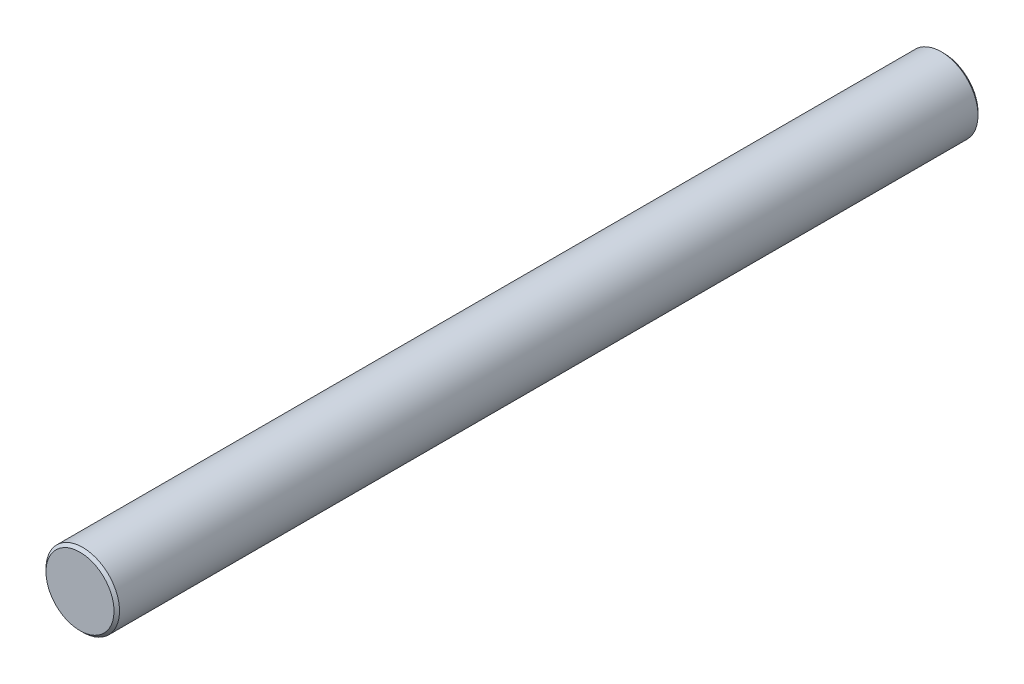
ISO-10303-21;
HEADER;
FILE_DESCRIPTION(('STEP AP214'),'2;1');
FILE_NAME('part.step','',(''),(''),'','','');
FILE_SCHEMA(('AUTOMOTIVE_DESIGN { 1 0 10303 214 1 1 1 1 }'));
ENDSEC;
DATA;
#1=APPLICATION_CONTEXT('core data for automotive mechanical design processes');
#2=APPLICATION_PROTOCOL_DEFINITION('international standard','automotive_design',2000,#1);
#3=PRODUCT_CONTEXT('',#1,'mechanical');
#4=PRODUCT('Part','Part','',(#3));
#5=PRODUCT_RELATED_PRODUCT_CATEGORY('part','',(#4));
#6=PRODUCT_DEFINITION_FORMATION('','',#4);
#7=PRODUCT_DEFINITION_CONTEXT('part definition',#1,'design');
#8=PRODUCT_DEFINITION('design','',#6,#7);
#9=PRODUCT_DEFINITION_SHAPE('','',#8);
#10=(LENGTH_UNIT() NAMED_UNIT(*) SI_UNIT(.MILLI.,.METRE.));
#11=(NAMED_UNIT(*) PLANE_ANGLE_UNIT() SI_UNIT($,.RADIAN.));
#12=(NAMED_UNIT(*) SI_UNIT($,.STERADIAN.) SOLID_ANGLE_UNIT());
#13=UNCERTAINTY_MEASURE_WITH_UNIT(LENGTH_MEASURE(1.E-05),#10,'distance_accuracy_value','');
#14=(GEOMETRIC_REPRESENTATION_CONTEXT(3) GLOBAL_UNCERTAINTY_ASSIGNED_CONTEXT((#13)) GLOBAL_UNIT_ASSIGNED_CONTEXT((#10,
#11,#12)) REPRESENTATION_CONTEXT('',''));
#15=CARTESIAN_POINT('',(0.,0.,0.));
#16=DIRECTION('',(0.,0.,1.));
#17=DIRECTION('',(1.,0.,0.));
#18=AXIS2_PLACEMENT_3D('',#15,#16,#17);
#19=CARTESIAN_POINT('',(0.,9.25,0.));
#20=DIRECTION('',(0.,0.,-1.));
#21=DIRECTION('',(0.,1.,0.));
#22=AXIS2_PLACEMENT_3D('',#19,#20,#21);
#23=PLANE('',#22);
#24=CARTESIAN_POINT('',(0.,0.,0.));
#25=DIRECTION('',(0.,0.,-1.));
#26=DIRECTION('',(0.,1.,0.));
#27=AXIS2_PLACEMENT_3D('',#24,#25,#26);
#28=CIRCLE('',#27,18.5);
#29=CARTESIAN_POINT('',(0.,18.5,0.));
#30=VERTEX_POINT('',#29);
#31=EDGE_CURVE('E9',#30,#30,#28,.T.);
#32=ORIENTED_EDGE('',*,*,#31,.T.);
#33=EDGE_LOOP('',(#32));
#34=FACE_BOUND('',#33,.T.);
#35=CARTESIAN_POINT('',(0.,0.,0.));
#36=DIRECTION('',(0.,0.,1.));
#37=DIRECTION('',(-1.,0.,0.));
#38=AXIS2_PLACEMENT_3D('',#35,#36,#37);
#39=CIRCLE('',#38,6.);
#40=CARTESIAN_POINT('',(-6.,0.,0.));
#41=VERTEX_POINT('',#40);
#42=EDGE_CURVE('E52',#41,#41,#39,.T.);
#43=ORIENTED_EDGE('',*,*,#42,.T.);
#44=EDGE_LOOP('',(#43));
#45=FACE_BOUND('',#44,.T.);
#46=ADVANCED_FACE('F15',(#34,#45),#23,.T.);
#47=CARTESIAN_POINT('',(0.,0.,0.75));
#48=DIRECTION('',(0.,0.,1.));
#49=DIRECTION('',(0.,1.,0.));
#50=AXIS2_PLACEMENT_3D('',#47,#48,#49);
#51=CONICAL_SURFACE('',#50,19.25,0.785398163397448);
#52=CARTESIAN_POINT('',(0.,0.,1.5));
#53=DIRECTION('',(0.,0.,-1.));
#54=DIRECTION('',(0.,1.,0.));
#55=AXIS2_PLACEMENT_3D('',#52,#53,#54);
#56=CIRCLE('',#55,20.);
#57=CARTESIAN_POINT('',(0.,20.,1.5));
#58=VERTEX_POINT('',#57);
#59=EDGE_CURVE('E25',#58,#58,#56,.T.);
#60=ORIENTED_EDGE('',*,*,#59,.T.);
#61=EDGE_LOOP('',(#60));
#62=FACE_BOUND('',#61,.T.);
#63=ORIENTED_EDGE('',*,*,#31,.F.);
#64=EDGE_LOOP('',(#63));
#65=FACE_BOUND('',#64,.T.);
#66=ADVANCED_FACE('F121',(#62,#65),#51,.T.);
#67=CARTESIAN_POINT('',(0.,0.,235.));
#68=DIRECTION('',(0.,0.,1.));
#69=DIRECTION('',(0.,1.,0.));
#70=AXIS2_PLACEMENT_3D('',#67,#68,#69);
#71=CYLINDRICAL_SURFACE('',#70,20.);
#72=CARTESIAN_POINT('',(0.,0.,468.5));
#73=DIRECTION('',(0.,0.,-1.));
#74=DIRECTION('',(0.,1.,0.));
#75=AXIS2_PLACEMENT_3D('',#72,#73,#74);
#76=CIRCLE('',#75,20.);
#77=CARTESIAN_POINT('',(0.,20.,468.5));
#78=VERTEX_POINT('',#77);
#79=EDGE_CURVE('E19',#78,#78,#76,.T.);
#80=ORIENTED_EDGE('',*,*,#79,.T.);
#81=EDGE_LOOP('',(#80));
#82=FACE_BOUND('',#81,.T.);
#83=ORIENTED_EDGE('',*,*,#59,.F.);
#84=EDGE_LOOP('',(#83));
#85=FACE_BOUND('',#84,.T.);
#86=CARTESIAN_POINT('',(0.,0.,6.5));
#87=DIRECTION('',(0.,0.,-1.));
#88=DIRECTION('',(0.,1.,0.));
#89=AXIS2_PLACEMENT_3D('',#86,#87,#88);
#90=CIRCLE('',#89,20.);
#91=CARTESIAN_POINT('',(10.5356537528527,-17.,6.5));
#92=VERTEX_POINT('',#91);
#93=CARTESIAN_POINT('',(-10.5356537528527,-17.,6.5));
#94=VERTEX_POINT('',#93);
#95=EDGE_CURVE('E69',#92,#94,#90,.T.);
#96=ORIENTED_EDGE('',*,*,#95,.T.);
#97=DIRECTION('',(0.,0.,1.));
#98=VECTOR('',#97,1.);
#99=CARTESIAN_POINT('',(-10.5356537528527,-17.,8.25));
#100=LINE('',#99,#98);
#101=CARTESIAN_POINT('',(-10.5356537528527,-17.,10.));
#102=VERTEX_POINT('',#101);
#103=EDGE_CURVE('E62',#94,#102,#100,.T.);
#104=ORIENTED_EDGE('',*,*,#103,.T.);
#105=CARTESIAN_POINT('',(0.,0.,10.));
#106=DIRECTION('',(0.,0.,1.));
#107=DIRECTION('',(0.,1.,0.));
#108=AXIS2_PLACEMENT_3D('',#105,#106,#107);
#109=CIRCLE('',#108,20.);
#110=CARTESIAN_POINT('',(10.5356537528527,-17.,10.));
#111=VERTEX_POINT('',#110);
#112=EDGE_CURVE('E75',#102,#111,#109,.T.);
#113=ORIENTED_EDGE('',*,*,#112,.T.);
#114=DIRECTION('',(0.,0.,-1.));
#115=VECTOR('',#114,1.);
#116=CARTESIAN_POINT('',(10.5356537528527,-17.,8.25));
#117=LINE('',#116,#115);
#118=EDGE_CURVE('E60',#111,#92,#117,.T.);
#119=ORIENTED_EDGE('',*,*,#118,.T.);
#120=EDGE_LOOP('',(#96,#104,#113,#119));
#121=FACE_BOUND('',#120,.T.);
#122=ADVANCED_FACE('F17',(#82,#85,#121),#71,.T.);
#123=CARTESIAN_POINT('',(0.,0.,469.25));
#124=DIRECTION('',(0.,0.,-1.));
#125=DIRECTION('',(0.,1.,0.));
#126=AXIS2_PLACEMENT_3D('',#123,#124,#125);
#127=CONICAL_SURFACE('',#126,19.25,0.785398163397448);
#128=CARTESIAN_POINT('',(0.,0.,470.));
#129=DIRECTION('',(0.,0.,-1.));
#130=DIRECTION('',(0.,1.,0.));
#131=AXIS2_PLACEMENT_3D('',#128,#129,#130);
#132=CIRCLE('',#131,18.5);
#133=CARTESIAN_POINT('',(0.,18.5,470.));
#134=VERTEX_POINT('',#133);
#135=EDGE_CURVE('E44',#134,#134,#132,.T.);
#136=ORIENTED_EDGE('',*,*,#135,.T.);
#137=EDGE_LOOP('',(#136));
#138=FACE_BOUND('',#137,.T.);
#139=ORIENTED_EDGE('',*,*,#79,.F.);
#140=EDGE_LOOP('',(#139));
#141=FACE_BOUND('',#140,.T.);
#142=ADVANCED_FACE('F116',(#138,#141),#127,.T.);
#143=CARTESIAN_POINT('',(0.,9.25,470.));
#144=DIRECTION('',(0.,0.,1.));
#145=DIRECTION('',(0.,-1.,0.));
#146=AXIS2_PLACEMENT_3D('',#143,#144,#145);
#147=PLANE('',#146);
#148=ORIENTED_EDGE('',*,*,#135,.F.);
#149=EDGE_LOOP('',(#148));
#150=FACE_BOUND('',#149,.T.);
#151=ADVANCED_FACE('F110',(#150),#147,.T.);
#152=CARTESIAN_POINT('',(0.,0.,26.4586213285198));
#153=DIRECTION('',(0.,0.,-1.));
#154=DIRECTION('',(-1.,0.,0.));
#155=AXIS2_PLACEMENT_3D('',#152,#153,#154);
#156=CONICAL_SURFACE('',#155,2.52640625,1.0471975511966);
#157=CARTESIAN_POINT('',(0.,0.,25.));
#158=DIRECTION('',(0.,0.,1.));
#159=DIRECTION('',(-1.,0.,0.));
#160=AXIS2_PLACEMENT_3D('',#157,#158,#159);
#161=CIRCLE('',#160,5.0528125);
#162=CARTESIAN_POINT('',(-5.0528125,0.,25.));
#163=VERTEX_POINT('',#162);
#164=EDGE_CURVE('E51',#163,#163,#161,.T.);
#165=ORIENTED_EDGE('',*,*,#164,.F.);
#166=EDGE_LOOP('',(#165));
#167=FACE_BOUND('',#166,.T.);
#168=CARTESIAN_POINT('',(0.,0.,27.9172426570397));
#169=VERTEX_POINT('',#168);
#170=VERTEX_LOOP('',#169);
#171=FACE_BOUND('',#170,.T.);
#172=ADVANCED_FACE('F104',(#167,#171),#156,.F.);
#173=CARTESIAN_POINT('',(0.,0.,12.97359375));
#174=DIRECTION('',(0.,0.,-1.));
#175=DIRECTION('',(-1.,0.,0.));
#176=AXIS2_PLACEMENT_3D('',#173,#174,#175);
#177=CYLINDRICAL_SURFACE('',#176,5.0528125);
#178=CARTESIAN_POINT('',(0.,0.,0.9471875));
#179=DIRECTION('',(0.,0.,1.));
#180=DIRECTION('',(-1.,0.,0.));
#181=AXIS2_PLACEMENT_3D('',#178,#179,#180);
#182=CIRCLE('',#181,5.0528125);
#183=CARTESIAN_POINT('',(-5.0528125,0.,0.9471875));
#184=VERTEX_POINT('',#183);
#185=EDGE_CURVE('E57',#184,#184,#182,.T.);
#186=ORIENTED_EDGE('',*,*,#185,.F.);
#187=EDGE_LOOP('',(#186));
#188=FACE_BOUND('',#187,.T.);
#189=ORIENTED_EDGE('',*,*,#164,.T.);
#190=EDGE_LOOP('',(#189));
#191=FACE_BOUND('',#190,.T.);
#192=ADVANCED_FACE('F101',(#188,#191),#177,.F.);
#193=CARTESIAN_POINT('',(0.,0.,0.47359375));
#194=DIRECTION('',(0.,0.,-1.));
#195=DIRECTION('',(-1.,0.,0.));
#196=AXIS2_PLACEMENT_3D('',#193,#194,#195);
#197=CONICAL_SURFACE('',#196,5.52640625,0.785398163397448);
#198=ORIENTED_EDGE('',*,*,#42,.F.);
#199=EDGE_LOOP('',(#198));
#200=FACE_BOUND('',#199,.T.);
#201=ORIENTED_EDGE('',*,*,#185,.T.);
#202=EDGE_LOOP('',(#201));
#203=FACE_BOUND('',#202,.T.);
#204=ADVANCED_FACE('F99',(#200,#203),#197,.F.);
#205=CARTESIAN_POINT('',(0.,-17.,8.25));
#206=DIRECTION('',(0.,-1.,0.));
#207=DIRECTION('',(0.,0.,-1.));
#208=AXIS2_PLACEMENT_3D('',#205,#206,#207);
#209=PLANE('',#208);
#210=ORIENTED_EDGE('',*,*,#103,.F.);
#211=DIRECTION('',(1.,0.,0.));
#212=VECTOR('',#211,1.);
#213=CARTESIAN_POINT('',(0.,-17.,6.5));
#214=LINE('',#213,#212);
#215=EDGE_CURVE('E66',#94,#92,#214,.T.);
#216=ORIENTED_EDGE('',*,*,#215,.T.);
#217=ORIENTED_EDGE('',*,*,#118,.F.);
#218=DIRECTION('',(-1.,0.,0.));
#219=VECTOR('',#218,1.);
#220=CARTESIAN_POINT('',(0.,-17.,10.));
#221=LINE('',#220,#219);
#222=EDGE_CURVE('E72',#111,#102,#221,.T.);
#223=ORIENTED_EDGE('',*,*,#222,.T.);
#224=EDGE_LOOP('',(#210,#216,#217,#223));
#225=FACE_BOUND('',#224,.T.);
#226=ADVANCED_FACE('F131',(#225),#209,.T.);
#227=CARTESIAN_POINT('',(0.,-19.5,6.5));
#228=DIRECTION('',(0.,0.,1.));
#229=DIRECTION('',(1.,0.,0.));
#230=AXIS2_PLACEMENT_3D('',#227,#228,#229);
#231=PLANE('',#230);
#232=ORIENTED_EDGE('',*,*,#95,.F.);
#233=ORIENTED_EDGE('',*,*,#215,.F.);
#234=EDGE_LOOP('',(#232,#233));
#235=FACE_BOUND('',#234,.T.);
#236=ADVANCED_FACE('F135',(#235),#231,.T.);
#237=CARTESIAN_POINT('',(0.,-19.5,10.));
#238=DIRECTION('',(0.,0.,1.));
#239=DIRECTION('',(1.,0.,0.));
#240=AXIS2_PLACEMENT_3D('',#237,#238,#239);
#241=PLANE('',#240);
#242=ORIENTED_EDGE('',*,*,#112,.F.);
#243=ORIENTED_EDGE('',*,*,#222,.F.);
#244=EDGE_LOOP('',(#242,#243));
#245=FACE_BOUND('',#244,.T.);
#246=ADVANCED_FACE('F87',(#245),#241,.F.);
#247=CLOSED_SHELL('',(#46,#66,#122,#142,#151,#172,#192,#204,#226,#236,#246));
#248=MANIFOLD_SOLID_BREP('B1',#247);
#249=ADVANCED_BREP_SHAPE_REPRESENTATION('',(#18,#248),#14);
#250=SHAPE_DEFINITION_REPRESENTATION(#9,#249);
ENDSEC;
END-ISO-10303-21;
